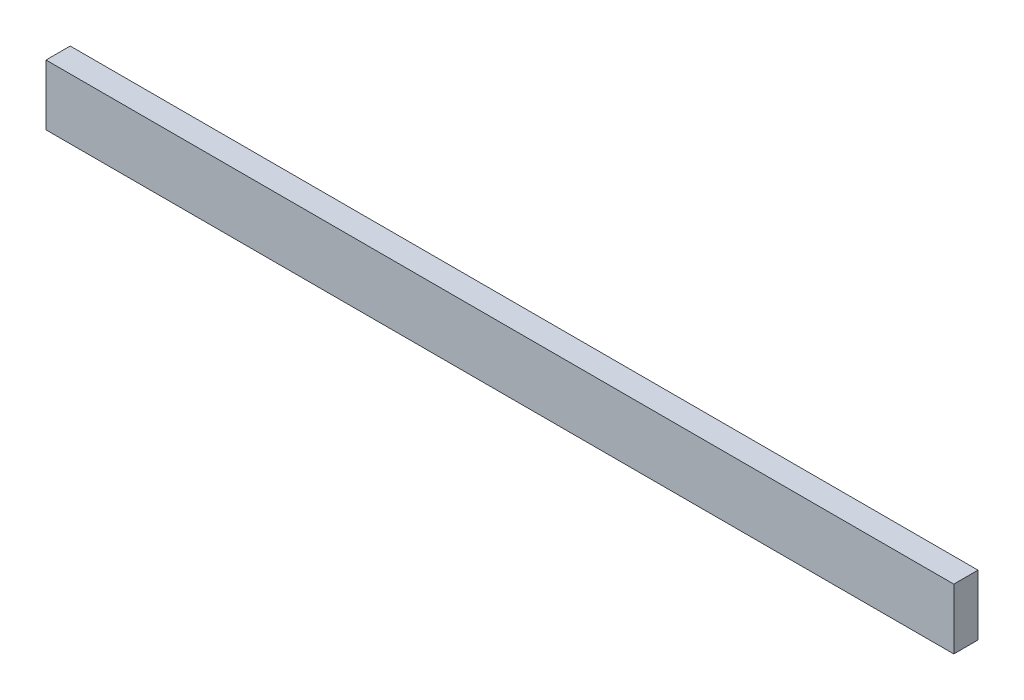
ISO-10303-21;
HEADER;
FILE_DESCRIPTION(('STEP AP214'),'2;1');
FILE_NAME('part.step','',(''),(''),'','','');
FILE_SCHEMA(('AUTOMOTIVE_DESIGN { 1 0 10303 214 1 1 1 1 }'));
ENDSEC;
DATA;
#1=APPLICATION_CONTEXT('core data for automotive mechanical design processes');
#2=APPLICATION_PROTOCOL_DEFINITION('international standard','automotive_design',2000,#1);
#3=PRODUCT_CONTEXT('',#1,'mechanical');
#4=PRODUCT('Part','Part','',(#3));
#5=PRODUCT_RELATED_PRODUCT_CATEGORY('part','',(#4));
#6=PRODUCT_DEFINITION_FORMATION('','',#4);
#7=PRODUCT_DEFINITION_CONTEXT('part definition',#1,'design');
#8=PRODUCT_DEFINITION('design','',#6,#7);
#9=PRODUCT_DEFINITION_SHAPE('','',#8);
#10=(LENGTH_UNIT() NAMED_UNIT(*) SI_UNIT(.MILLI.,.METRE.));
#11=(NAMED_UNIT(*) PLANE_ANGLE_UNIT() SI_UNIT($,.RADIAN.));
#12=(NAMED_UNIT(*) SI_UNIT($,.STERADIAN.) SOLID_ANGLE_UNIT());
#13=UNCERTAINTY_MEASURE_WITH_UNIT(LENGTH_MEASURE(1.E-05),#10,'distance_accuracy_value','');
#14=(GEOMETRIC_REPRESENTATION_CONTEXT(3) GLOBAL_UNCERTAINTY_ASSIGNED_CONTEXT((#13)) GLOBAL_UNIT_ASSIGNED_CONTEXT((#10,
#11,#12)) REPRESENTATION_CONTEXT('',''));
#15=CARTESIAN_POINT('',(0.,0.,0.));
#16=DIRECTION('',(0.,0.,1.));
#17=DIRECTION('',(1.,0.,0.));
#18=AXIS2_PLACEMENT_3D('',#15,#16,#17);
#19=CARTESIAN_POINT('',(0.,0.,4.));
#20=DIRECTION('',(1.,0.,0.));
#21=DIRECTION('',(0.,0.,-1.));
#22=AXIS2_PLACEMENT_3D('',#19,#20,#21);
#23=PLANE('',#22);
#24=DIRECTION('',(0.,-1.,0.));
#25=VECTOR('',#24,1.);
#26=CARTESIAN_POINT('',(0.,0.,0.));
#27=LINE('',#26,#25);
#28=CARTESIAN_POINT('',(0.,10.,0.));
#29=VERTEX_POINT('',#28);
#30=CARTESIAN_POINT('',(0.,0.,0.));
#31=VERTEX_POINT('',#30);
#32=EDGE_CURVE('E113',#29,#31,#27,.T.);
#33=ORIENTED_EDGE('',*,*,#32,.T.);
#34=DIRECTION('',(0.,0.,-1.));
#35=VECTOR('',#34,1.);
#36=CARTESIAN_POINT('',(0.,0.,4.));
#37=LINE('',#36,#35);
#38=CARTESIAN_POINT('',(0.,0.,4.));
#39=VERTEX_POINT('',#38);
#40=EDGE_CURVE('E11',#39,#31,#37,.T.);
#41=ORIENTED_EDGE('',*,*,#40,.F.);
#42=DIRECTION('',(0.,-1.,0.));
#43=VECTOR('',#42,1.);
#44=CARTESIAN_POINT('',(0.,0.,4.));
#45=LINE('',#44,#43);
#46=CARTESIAN_POINT('',(0.,10.,4.));
#47=VERTEX_POINT('',#46);
#48=EDGE_CURVE('E97',#47,#39,#45,.T.);
#49=ORIENTED_EDGE('',*,*,#48,.F.);
#50=DIRECTION('',(0.,0.,-1.));
#51=VECTOR('',#50,1.);
#52=CARTESIAN_POINT('',(0.,10.,4.));
#53=LINE('',#52,#51);
#54=EDGE_CURVE('E109',#47,#29,#53,.T.);
#55=ORIENTED_EDGE('',*,*,#54,.T.);
#56=EDGE_LOOP('',(#33,#41,#49,#55));
#57=FACE_BOUND('',#56,.T.);
#58=ADVANCED_FACE('F45',(#57),#23,.F.);
#59=CARTESIAN_POINT('',(0.,0.,4.));
#60=DIRECTION('',(0.,1.,0.));
#61=DIRECTION('',(0.,0.,1.));
#62=AXIS2_PLACEMENT_3D('',#59,#60,#61);
#63=PLANE('',#62);
#64=DIRECTION('',(1.,0.,0.));
#65=VECTOR('',#64,1.);
#66=CARTESIAN_POINT('',(0.,0.,0.));
#67=LINE('',#66,#65);
#68=CARTESIAN_POINT('',(150.,0.,0.));
#69=VERTEX_POINT('',#68);
#70=EDGE_CURVE('E102',#31,#69,#67,.T.);
#71=ORIENTED_EDGE('',*,*,#70,.T.);
#72=DIRECTION('',(0.,0.,-1.));
#73=VECTOR('',#72,1.);
#74=CARTESIAN_POINT('',(150.,0.,4.));
#75=LINE('',#74,#73);
#76=CARTESIAN_POINT('',(150.,0.,4.));
#77=VERTEX_POINT('',#76);
#78=EDGE_CURVE('E54',#77,#69,#75,.T.);
#79=ORIENTED_EDGE('',*,*,#78,.F.);
#80=DIRECTION('',(1.,0.,0.));
#81=VECTOR('',#80,1.);
#82=CARTESIAN_POINT('',(0.,0.,4.));
#83=LINE('',#82,#81);
#84=EDGE_CURVE('E92',#39,#77,#83,.T.);
#85=ORIENTED_EDGE('',*,*,#84,.F.);
#86=ORIENTED_EDGE('',*,*,#40,.T.);
#87=EDGE_LOOP('',(#71,#79,#85,#86));
#88=FACE_BOUND('',#87,.T.);
#89=ADVANCED_FACE('F101',(#88),#63,.F.);
#90=CARTESIAN_POINT('',(150.,0.,4.));
#91=DIRECTION('',(-1.,0.,0.));
#92=DIRECTION('',(0.,0.,1.));
#93=AXIS2_PLACEMENT_3D('',#90,#91,#92);
#94=PLANE('',#93);
#95=DIRECTION('',(0.,1.,0.));
#96=VECTOR('',#95,1.);
#97=CARTESIAN_POINT('',(150.,0.,0.));
#98=LINE('',#97,#96);
#99=CARTESIAN_POINT('',(150.,10.,0.));
#100=VERTEX_POINT('',#99);
#101=EDGE_CURVE('E79',#69,#100,#98,.T.);
#102=ORIENTED_EDGE('',*,*,#101,.T.);
#103=DIRECTION('',(0.,0.,-1.));
#104=VECTOR('',#103,1.);
#105=CARTESIAN_POINT('',(150.,10.,4.));
#106=LINE('',#105,#104);
#107=CARTESIAN_POINT('',(150.,10.,4.));
#108=VERTEX_POINT('',#107);
#109=EDGE_CURVE('E104',#108,#100,#106,.T.);
#110=ORIENTED_EDGE('',*,*,#109,.F.);
#111=DIRECTION('',(0.,1.,0.));
#112=VECTOR('',#111,1.);
#113=CARTESIAN_POINT('',(150.,0.,4.));
#114=LINE('',#113,#112);
#115=EDGE_CURVE('E95',#77,#108,#114,.T.);
#116=ORIENTED_EDGE('',*,*,#115,.F.);
#117=ORIENTED_EDGE('',*,*,#78,.T.);
#118=EDGE_LOOP('',(#102,#110,#116,#117));
#119=FACE_BOUND('',#118,.T.);
#120=ADVANCED_FACE('F105',(#119),#94,.F.);
#121=CARTESIAN_POINT('',(0.,10.,4.));
#122=DIRECTION('',(0.,-1.,0.));
#123=DIRECTION('',(0.,0.,-1.));
#124=AXIS2_PLACEMENT_3D('',#121,#122,#123);
#125=PLANE('',#124);
#126=DIRECTION('',(-1.,0.,0.));
#127=VECTOR('',#126,1.);
#128=CARTESIAN_POINT('',(0.,10.,0.));
#129=LINE('',#128,#127);
#130=EDGE_CURVE('E85',#100,#29,#129,.T.);
#131=ORIENTED_EDGE('',*,*,#130,.T.);
#132=ORIENTED_EDGE('',*,*,#54,.F.);
#133=DIRECTION('',(-1.,0.,0.));
#134=VECTOR('',#133,1.);
#135=CARTESIAN_POINT('',(0.,10.,4.));
#136=LINE('',#135,#134);
#137=EDGE_CURVE('E62',#108,#47,#136,.T.);
#138=ORIENTED_EDGE('',*,*,#137,.F.);
#139=ORIENTED_EDGE('',*,*,#109,.T.);
#140=EDGE_LOOP('',(#131,#132,#138,#139));
#141=FACE_BOUND('',#140,.T.);
#142=ADVANCED_FACE('F126',(#141),#125,.F.);
#143=CARTESIAN_POINT('',(0.,0.,4.));
#144=DIRECTION('',(0.,0.,-1.));
#145=DIRECTION('',(-1.,0.,0.));
#146=AXIS2_PLACEMENT_3D('',#143,#144,#145);
#147=PLANE('',#146);
#148=ORIENTED_EDGE('',*,*,#48,.T.);
#149=ORIENTED_EDGE('',*,*,#84,.T.);
#150=ORIENTED_EDGE('',*,*,#115,.T.);
#151=ORIENTED_EDGE('',*,*,#137,.T.);
#152=EDGE_LOOP('',(#148,#149,#150,#151));
#153=FACE_BOUND('',#152,.T.);
#154=ADVANCED_FACE('F93',(#153),#147,.F.);
#155=CARTESIAN_POINT('',(0.,0.,0.));
#156=DIRECTION('',(0.,0.,-1.));
#157=DIRECTION('',(-1.,0.,0.));
#158=AXIS2_PLACEMENT_3D('',#155,#156,#157);
#159=PLANE('',#158);
#160=ORIENTED_EDGE('',*,*,#32,.F.);
#161=ORIENTED_EDGE('',*,*,#130,.F.);
#162=ORIENTED_EDGE('',*,*,#101,.F.);
#163=ORIENTED_EDGE('',*,*,#70,.F.);
#164=EDGE_LOOP('',(#160,#161,#162,#163));
#165=FACE_BOUND('',#164,.T.);
#166=ADVANCED_FACE('F129',(#165),#159,.T.);
#167=CLOSED_SHELL('',(#58,#89,#120,#142,#154,#166));
#168=MANIFOLD_SOLID_BREP('B2',#167);
#169=ADVANCED_BREP_SHAPE_REPRESENTATION('',(#18,#168),#14);
#170=SHAPE_DEFINITION_REPRESENTATION(#9,#169);
ENDSEC;
END-ISO-10303-21;
